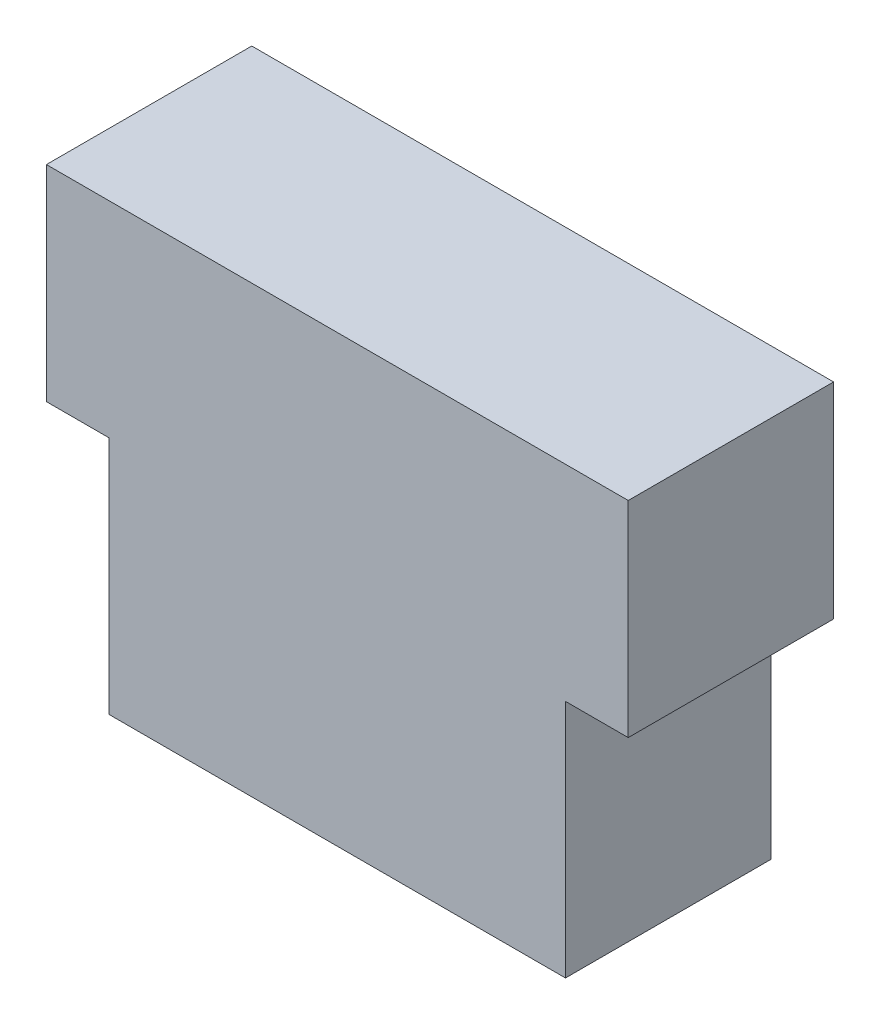
ISO-10303-21;
HEADER;
FILE_DESCRIPTION(('STEP AP214'),'2;1');
FILE_NAME('part.step','',(''),(''),'','','');
FILE_SCHEMA(('AUTOMOTIVE_DESIGN { 1 0 10303 214 1 1 1 1 }'));
ENDSEC;
DATA;
#1=APPLICATION_CONTEXT('core data for automotive mechanical design processes');
#2=APPLICATION_PROTOCOL_DEFINITION('international standard','automotive_design',2000,#1);
#3=PRODUCT_CONTEXT('',#1,'mechanical');
#4=PRODUCT('Part','Part','',(#3));
#5=PRODUCT_RELATED_PRODUCT_CATEGORY('part','',(#4));
#6=PRODUCT_DEFINITION_FORMATION('','',#4);
#7=PRODUCT_DEFINITION_CONTEXT('part definition',#1,'design');
#8=PRODUCT_DEFINITION('design','',#6,#7);
#9=PRODUCT_DEFINITION_SHAPE('','',#8);
#10=(LENGTH_UNIT() NAMED_UNIT(*) SI_UNIT(.MILLI.,.METRE.));
#11=(NAMED_UNIT(*) PLANE_ANGLE_UNIT() SI_UNIT($,.RADIAN.));
#12=(NAMED_UNIT(*) SI_UNIT($,.STERADIAN.) SOLID_ANGLE_UNIT());
#13=UNCERTAINTY_MEASURE_WITH_UNIT(LENGTH_MEASURE(1.E-05),#10,'distance_accuracy_value','');
#14=(GEOMETRIC_REPRESENTATION_CONTEXT(3) GLOBAL_UNCERTAINTY_ASSIGNED_CONTEXT((#13)) GLOBAL_UNIT_ASSIGNED_CONTEXT((#10,
#11,#12)) REPRESENTATION_CONTEXT('',''));
#15=CARTESIAN_POINT('',(0.,0.,0.));
#16=DIRECTION('',(0.,0.,1.));
#17=DIRECTION('',(1.,0.,0.));
#18=AXIS2_PLACEMENT_3D('',#15,#16,#17);
#19=CARTESIAN_POINT('',(0.,19.5,18.));
#20=DIRECTION('',(0.,-1.,0.));
#21=DIRECTION('',(0.,0.,-1.));
#22=AXIS2_PLACEMENT_3D('',#19,#20,#21);
#23=PLANE('',#22);
#24=DIRECTION('',(-1.,0.,0.));
#25=VECTOR('',#24,1.);
#26=CARTESIAN_POINT('',(0.,19.5,0.));
#27=LINE('',#26,#25);
#28=CARTESIAN_POINT('',(25.5,19.5,0.));
#29=VERTEX_POINT('',#28);
#30=CARTESIAN_POINT('',(-25.5,19.5,0.));
#31=VERTEX_POINT('',#30);
#32=EDGE_CURVE('E149',#29,#31,#27,.T.);
#33=ORIENTED_EDGE('',*,*,#32,.T.);
#34=DIRECTION('',(0.,0.,-1.));
#35=VECTOR('',#34,1.);
#36=CARTESIAN_POINT('',(-25.5,19.5,18.));
#37=LINE('',#36,#35);
#38=CARTESIAN_POINT('',(-25.5,19.5,18.));
#39=VERTEX_POINT('',#38);
#40=EDGE_CURVE('E11',#39,#31,#37,.T.);
#41=ORIENTED_EDGE('',*,*,#40,.F.);
#42=DIRECTION('',(-1.,0.,0.));
#43=VECTOR('',#42,1.);
#44=CARTESIAN_POINT('',(0.,19.5,18.));
#45=LINE('',#44,#43);
#46=CARTESIAN_POINT('',(25.5,19.5,18.));
#47=VERTEX_POINT('',#46);
#48=EDGE_CURVE('E177',#47,#39,#45,.T.);
#49=ORIENTED_EDGE('',*,*,#48,.F.);
#50=DIRECTION('',(0.,0.,-1.));
#51=VECTOR('',#50,1.);
#52=CARTESIAN_POINT('',(25.5,19.5,18.));
#53=LINE('',#52,#51);
#54=EDGE_CURVE('E62',#47,#29,#53,.T.);
#55=ORIENTED_EDGE('',*,*,#54,.T.);
#56=EDGE_LOOP('',(#33,#41,#49,#55));
#57=FACE_BOUND('',#56,.T.);
#58=ADVANCED_FACE('F45',(#57),#23,.F.);
#59=CARTESIAN_POINT('',(-25.5,0.,18.));
#60=DIRECTION('',(1.,0.,0.));
#61=DIRECTION('',(0.,1.,0.));
#62=AXIS2_PLACEMENT_3D('',#59,#60,#61);
#63=PLANE('',#62);
#64=DIRECTION('',(0.,-1.,0.));
#65=VECTOR('',#64,1.);
#66=CARTESIAN_POINT('',(-25.5,0.,0.));
#67=LINE('',#66,#65);
#68=CARTESIAN_POINT('',(-25.5,1.49999999999999,0.));
#69=VERTEX_POINT('',#68);
#70=EDGE_CURVE('E152',#31,#69,#67,.T.);
#71=ORIENTED_EDGE('',*,*,#70,.T.);
#72=DIRECTION('',(0.,0.,-1.));
#73=VECTOR('',#72,1.);
#74=CARTESIAN_POINT('',(-25.5,1.49999999999999,18.));
#75=LINE('',#74,#73);
#76=CARTESIAN_POINT('',(-25.5,1.49999999999999,18.));
#77=VERTEX_POINT('',#76);
#78=EDGE_CURVE('E54',#77,#69,#75,.T.);
#79=ORIENTED_EDGE('',*,*,#78,.F.);
#80=DIRECTION('',(0.,-1.,0.));
#81=VECTOR('',#80,1.);
#82=CARTESIAN_POINT('',(-25.5,0.,18.));
#83=LINE('',#82,#81);
#84=EDGE_CURVE('E101',#39,#77,#83,.T.);
#85=ORIENTED_EDGE('',*,*,#84,.F.);
#86=ORIENTED_EDGE('',*,*,#40,.T.);
#87=EDGE_LOOP('',(#71,#79,#85,#86));
#88=FACE_BOUND('',#87,.T.);
#89=ADVANCED_FACE('F196',(#88),#63,.F.);
#90=CARTESIAN_POINT('',(0.,1.49999999999999,18.));
#91=DIRECTION('',(0.,-1.,0.));
#92=DIRECTION('',(0.,0.,-1.));
#93=AXIS2_PLACEMENT_3D('',#90,#91,#92);
#94=PLANE('',#93);
#95=DIRECTION('',(-1.,0.,0.));
#96=VECTOR('',#95,1.);
#97=CARTESIAN_POINT('',(0.,1.49999999999999,0.));
#98=LINE('',#97,#96);
#99=CARTESIAN_POINT('',(-20.,1.49999999999999,0.));
#100=VERTEX_POINT('',#99);
#101=EDGE_CURVE('E156',#100,#69,#98,.T.);
#102=ORIENTED_EDGE('',*,*,#101,.F.);
#103=DIRECTION('',(0.,0.,-1.));
#104=VECTOR('',#103,1.);
#105=CARTESIAN_POINT('',(-20.,1.49999999999999,18.));
#106=LINE('',#105,#104);
#107=CARTESIAN_POINT('',(-20.,1.49999999999999,18.));
#108=VERTEX_POINT('',#107);
#109=EDGE_CURVE('E187',#108,#100,#106,.T.);
#110=ORIENTED_EDGE('',*,*,#109,.F.);
#111=DIRECTION('',(-1.,0.,0.));
#112=VECTOR('',#111,1.);
#113=CARTESIAN_POINT('',(0.,1.49999999999999,18.));
#114=LINE('',#113,#112);
#115=EDGE_CURVE('E195',#108,#77,#114,.T.);
#116=ORIENTED_EDGE('',*,*,#115,.T.);
#117=ORIENTED_EDGE('',*,*,#78,.T.);
#118=EDGE_LOOP('',(#102,#110,#116,#117));
#119=FACE_BOUND('',#118,.T.);
#120=ADVANCED_FACE('F193',(#119),#94,.T.);
#121=CARTESIAN_POINT('',(-20.,0.,18.));
#122=DIRECTION('',(1.,0.,0.));
#123=DIRECTION('',(0.,1.,0.));
#124=AXIS2_PLACEMENT_3D('',#121,#122,#123);
#125=PLANE('',#124);
#126=DIRECTION('',(0.,-1.,0.));
#127=VECTOR('',#126,1.);
#128=CARTESIAN_POINT('',(-20.,0.,0.));
#129=LINE('',#128,#127);
#130=CARTESIAN_POINT('',(-20.,-19.5,0.));
#131=VERTEX_POINT('',#130);
#132=EDGE_CURVE('E160',#100,#131,#129,.T.);
#133=ORIENTED_EDGE('',*,*,#132,.T.);
#134=DIRECTION('',(0.,0.,-1.));
#135=VECTOR('',#134,1.);
#136=CARTESIAN_POINT('',(-20.,-19.5,18.));
#137=LINE('',#136,#135);
#138=CARTESIAN_POINT('',(-20.,-19.5,18.));
#139=VERTEX_POINT('',#138);
#140=EDGE_CURVE('E184',#139,#131,#137,.T.);
#141=ORIENTED_EDGE('',*,*,#140,.F.);
#142=DIRECTION('',(0.,-1.,0.));
#143=VECTOR('',#142,1.);
#144=CARTESIAN_POINT('',(-20.,0.,18.));
#145=LINE('',#144,#143);
#146=EDGE_CURVE('E143',#108,#139,#145,.T.);
#147=ORIENTED_EDGE('',*,*,#146,.F.);
#148=ORIENTED_EDGE('',*,*,#109,.T.);
#149=EDGE_LOOP('',(#133,#141,#147,#148));
#150=FACE_BOUND('',#149,.T.);
#151=ADVANCED_FACE('F204',(#150),#125,.F.);
#152=CARTESIAN_POINT('',(0.,-19.5,18.));
#153=DIRECTION('',(0.,-1.,0.));
#154=DIRECTION('',(0.,0.,-1.));
#155=AXIS2_PLACEMENT_3D('',#152,#153,#154);
#156=PLANE('',#155);
#157=DIRECTION('',(-1.,0.,0.));
#158=VECTOR('',#157,1.);
#159=CARTESIAN_POINT('',(0.,-19.5,0.));
#160=LINE('',#159,#158);
#161=CARTESIAN_POINT('',(20.,-19.5,0.));
#162=VERTEX_POINT('',#161);
#163=EDGE_CURVE('E164',#162,#131,#160,.T.);
#164=ORIENTED_EDGE('',*,*,#163,.F.);
#165=DIRECTION('',(0.,0.,-1.));
#166=VECTOR('',#165,1.);
#167=CARTESIAN_POINT('',(20.,-19.5,18.));
#168=LINE('',#167,#166);
#169=CARTESIAN_POINT('',(20.,-19.5,18.));
#170=VERTEX_POINT('',#169);
#171=EDGE_CURVE('E127',#170,#162,#168,.T.);
#172=ORIENTED_EDGE('',*,*,#171,.F.);
#173=DIRECTION('',(-1.,0.,0.));
#174=VECTOR('',#173,1.);
#175=CARTESIAN_POINT('',(0.,-19.5,18.));
#176=LINE('',#175,#174);
#177=EDGE_CURVE('E139',#170,#139,#176,.T.);
#178=ORIENTED_EDGE('',*,*,#177,.T.);
#179=ORIENTED_EDGE('',*,*,#140,.T.);
#180=EDGE_LOOP('',(#164,#172,#178,#179));
#181=FACE_BOUND('',#180,.T.);
#182=ADVANCED_FACE('F234',(#181),#156,.T.);
#183=CARTESIAN_POINT('',(20.,0.,18.));
#184=DIRECTION('',(1.,0.,0.));
#185=DIRECTION('',(0.,0.,-1.));
#186=AXIS2_PLACEMENT_3D('',#183,#184,#185);
#187=PLANE('',#186);
#188=DIRECTION('',(0.,-1.,0.));
#189=VECTOR('',#188,1.);
#190=CARTESIAN_POINT('',(20.,0.,0.));
#191=LINE('',#190,#189);
#192=CARTESIAN_POINT('',(20.,1.5,0.));
#193=VERTEX_POINT('',#192);
#194=EDGE_CURVE('E123',#193,#162,#191,.T.);
#195=ORIENTED_EDGE('',*,*,#194,.F.);
#196=DIRECTION('',(0.,0.,-1.));
#197=VECTOR('',#196,1.);
#198=CARTESIAN_POINT('',(20.,1.5,18.));
#199=LINE('',#198,#197);
#200=CARTESIAN_POINT('',(20.,1.5,18.));
#201=VERTEX_POINT('',#200);
#202=EDGE_CURVE('E117',#201,#193,#199,.T.);
#203=ORIENTED_EDGE('',*,*,#202,.F.);
#204=DIRECTION('',(0.,-1.,0.));
#205=VECTOR('',#204,1.);
#206=CARTESIAN_POINT('',(20.,0.,18.));
#207=LINE('',#206,#205);
#208=EDGE_CURVE('E121',#201,#170,#207,.T.);
#209=ORIENTED_EDGE('',*,*,#208,.T.);
#210=ORIENTED_EDGE('',*,*,#171,.T.);
#211=EDGE_LOOP('',(#195,#203,#209,#210));
#212=FACE_BOUND('',#211,.T.);
#213=ADVANCED_FACE('F119',(#212),#187,.T.);
#214=CARTESIAN_POINT('',(0.,1.5,18.));
#215=DIRECTION('',(0.,1.,0.));
#216=DIRECTION('',(0.,0.,1.));
#217=AXIS2_PLACEMENT_3D('',#214,#215,#216);
#218=PLANE('',#217);
#219=DIRECTION('',(1.,0.,0.));
#220=VECTOR('',#219,1.);
#221=CARTESIAN_POINT('',(0.,1.5,0.));
#222=LINE('',#221,#220);
#223=CARTESIAN_POINT('',(25.5,1.5,0.));
#224=VERTEX_POINT('',#223);
#225=EDGE_CURVE('E170',#193,#224,#222,.T.);
#226=ORIENTED_EDGE('',*,*,#225,.T.);
#227=DIRECTION('',(0.,0.,-1.));
#228=VECTOR('',#227,1.);
#229=CARTESIAN_POINT('',(25.5,1.5,18.));
#230=LINE('',#229,#228);
#231=CARTESIAN_POINT('',(25.5,1.5,18.));
#232=VERTEX_POINT('',#231);
#233=EDGE_CURVE('E89',#232,#224,#230,.T.);
#234=ORIENTED_EDGE('',*,*,#233,.F.);
#235=DIRECTION('',(1.,0.,0.));
#236=VECTOR('',#235,1.);
#237=CARTESIAN_POINT('',(0.,1.5,18.));
#238=LINE('',#237,#236);
#239=EDGE_CURVE('E129',#201,#232,#238,.T.);
#240=ORIENTED_EDGE('',*,*,#239,.F.);
#241=ORIENTED_EDGE('',*,*,#202,.T.);
#242=EDGE_LOOP('',(#226,#234,#240,#241));
#243=FACE_BOUND('',#242,.T.);
#244=ADVANCED_FACE('F130',(#243),#218,.F.);
#245=CARTESIAN_POINT('',(25.5,0.,18.));
#246=DIRECTION('',(1.,0.,0.));
#247=DIRECTION('',(0.,1.,0.));
#248=AXIS2_PLACEMENT_3D('',#245,#246,#247);
#249=PLANE('',#248);
#250=DIRECTION('',(0.,-1.,0.));
#251=VECTOR('',#250,1.);
#252=CARTESIAN_POINT('',(25.5,0.,0.));
#253=LINE('',#252,#251);
#254=EDGE_CURVE('E173',#29,#224,#253,.T.);
#255=ORIENTED_EDGE('',*,*,#254,.F.);
#256=ORIENTED_EDGE('',*,*,#54,.F.);
#257=DIRECTION('',(0.,-1.,0.));
#258=VECTOR('',#257,1.);
#259=CARTESIAN_POINT('',(25.5,0.,18.));
#260=LINE('',#259,#258);
#261=EDGE_CURVE('E134',#47,#232,#260,.T.);
#262=ORIENTED_EDGE('',*,*,#261,.T.);
#263=ORIENTED_EDGE('',*,*,#233,.T.);
#264=EDGE_LOOP('',(#255,#256,#262,#263));
#265=FACE_BOUND('',#264,.T.);
#266=ADVANCED_FACE('F213',(#265),#249,.T.);
#267=CARTESIAN_POINT('',(0.,0.,18.));
#268=DIRECTION('',(0.,0.,1.));
#269=DIRECTION('',(1.,0.,0.));
#270=AXIS2_PLACEMENT_3D('',#267,#268,#269);
#271=PLANE('',#270);
#272=ORIENTED_EDGE('',*,*,#48,.T.);
#273=ORIENTED_EDGE('',*,*,#84,.T.);
#274=ORIENTED_EDGE('',*,*,#115,.F.);
#275=ORIENTED_EDGE('',*,*,#146,.T.);
#276=ORIENTED_EDGE('',*,*,#177,.F.);
#277=ORIENTED_EDGE('',*,*,#208,.F.);
#278=ORIENTED_EDGE('',*,*,#239,.T.);
#279=ORIENTED_EDGE('',*,*,#261,.F.);
#280=EDGE_LOOP('',(#272,#273,#274,#275,#276,#277,#278,#279));
#281=FACE_BOUND('',#280,.T.);
#282=ADVANCED_FACE('F137',(#281),#271,.T.);
#283=CARTESIAN_POINT('',(0.,0.,0.));
#284=DIRECTION('',(0.,0.,1.));
#285=DIRECTION('',(1.,0.,0.));
#286=AXIS2_PLACEMENT_3D('',#283,#284,#285);
#287=PLANE('',#286);
#288=ORIENTED_EDGE('',*,*,#32,.F.);
#289=ORIENTED_EDGE('',*,*,#254,.T.);
#290=ORIENTED_EDGE('',*,*,#225,.F.);
#291=ORIENTED_EDGE('',*,*,#194,.T.);
#292=ORIENTED_EDGE('',*,*,#163,.T.);
#293=ORIENTED_EDGE('',*,*,#132,.F.);
#294=ORIENTED_EDGE('',*,*,#101,.T.);
#295=ORIENTED_EDGE('',*,*,#70,.F.);
#296=EDGE_LOOP('',(#288,#289,#290,#291,#292,#293,#294,#295));
#297=FACE_BOUND('',#296,.T.);
#298=ADVANCED_FACE('F200',(#297),#287,.F.);
#299=CLOSED_SHELL('',(#58,#89,#120,#151,#182,#213,#244,#266,#282,#298));
#300=MANIFOLD_SOLID_BREP('B2',#299);
#301=ADVANCED_BREP_SHAPE_REPRESENTATION('',(#18,#300),#14);
#302=SHAPE_DEFINITION_REPRESENTATION(#9,#301);
ENDSEC;
END-ISO-10303-21;
